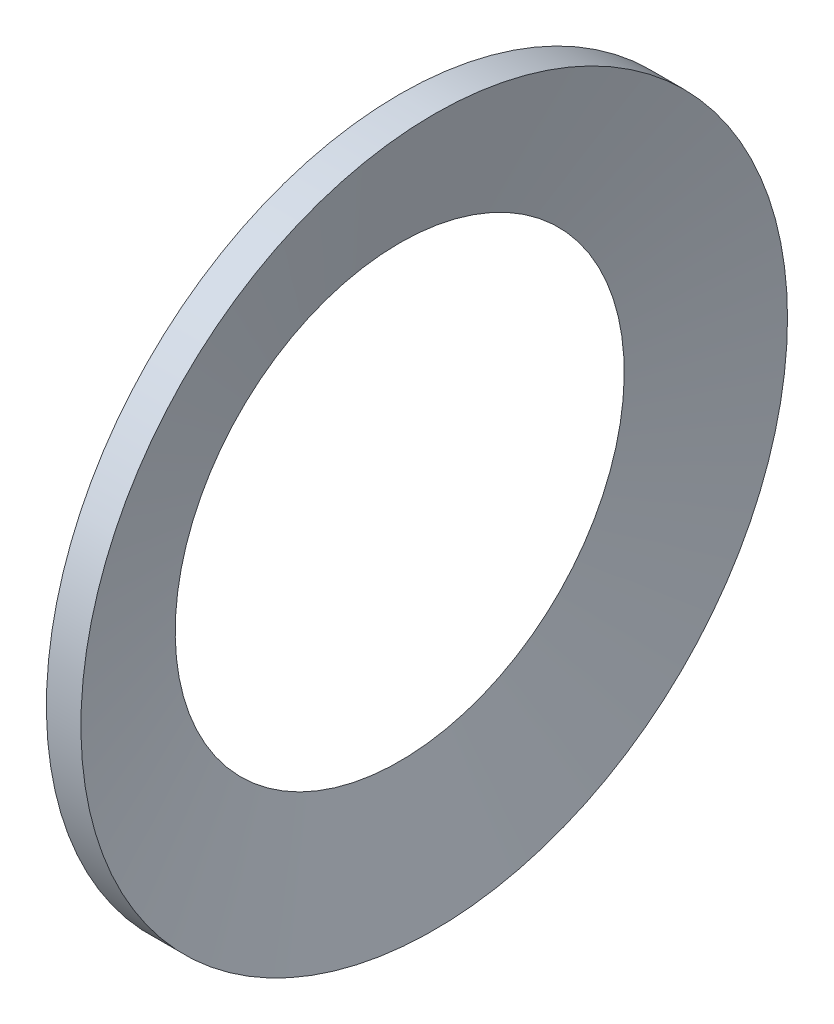
ISO-10303-21;
HEADER;
FILE_DESCRIPTION(('STEP AP214'),'2;1');
FILE_NAME('part.step','',(''),(''),'','','');
FILE_SCHEMA(('AUTOMOTIVE_DESIGN { 1 0 10303 214 1 1 1 1 }'));
ENDSEC;
DATA;
#1=APPLICATION_CONTEXT('core data for automotive mechanical design processes');
#2=APPLICATION_PROTOCOL_DEFINITION('international standard','automotive_design',2000,#1);
#3=PRODUCT_CONTEXT('',#1,'mechanical');
#4=PRODUCT('Part','Part','',(#3));
#5=PRODUCT_RELATED_PRODUCT_CATEGORY('part','',(#4));
#6=PRODUCT_DEFINITION_FORMATION('','',#4);
#7=PRODUCT_DEFINITION_CONTEXT('part definition',#1,'design');
#8=PRODUCT_DEFINITION('design','',#6,#7);
#9=PRODUCT_DEFINITION_SHAPE('','',#8);
#10=(LENGTH_UNIT() NAMED_UNIT(*) SI_UNIT(.MILLI.,.METRE.));
#11=(NAMED_UNIT(*) PLANE_ANGLE_UNIT() SI_UNIT($,.RADIAN.));
#12=(NAMED_UNIT(*) SI_UNIT($,.STERADIAN.) SOLID_ANGLE_UNIT());
#13=UNCERTAINTY_MEASURE_WITH_UNIT(LENGTH_MEASURE(1.E-05),#10,'distance_accuracy_value','');
#14=(GEOMETRIC_REPRESENTATION_CONTEXT(3) GLOBAL_UNCERTAINTY_ASSIGNED_CONTEXT((#13)) GLOBAL_UNIT_ASSIGNED_CONTEXT((#10,
#11,#12)) REPRESENTATION_CONTEXT('',''));
#15=CARTESIAN_POINT('',(0.,0.,0.));
#16=DIRECTION('',(0.,0.,1.));
#17=DIRECTION('',(1.,0.,0.));
#18=AXIS2_PLACEMENT_3D('',#15,#16,#17);
#19=CARTESIAN_POINT('',(-13.7701675001608,-45.6048472350062,-2.0607016462834));
#20=DIRECTION('',(1.,0.,0.));
#21=DIRECTION('',(0.,1.,0.));
#22=AXIS2_PLACEMENT_3D('',#19,#20,#21);
#23=PLANE('',#22);
#24=CARTESIAN_POINT('',(-13.7701675001608,-45.6048473189957,-2.0607016462799));
#25=DIRECTION('',(1.,0.,0.));
#26=DIRECTION('',(0.,1.,0.));
#27=AXIS2_PLACEMENT_3D('',#24,#25,#26);
#28=CIRCLE('',#27,19.1927324349238);
#29=CARTESIAN_POINT('',(-13.7701675001608,-26.4121148840719,-2.0607016462799));
#30=VERTEX_POINT('',#29);
#31=EDGE_CURVE('E35',#30,#30,#28,.T.);
#32=ORIENTED_EDGE('',*,*,#31,.T.);
#33=EDGE_LOOP('',(#32));
#34=FACE_BOUND('',#33,.T.);
#35=CARTESIAN_POINT('',(-13.7701675001608,-45.6048472350062,-2.0607016462834));
#36=DIRECTION('',(1.,0.,0.));
#37=DIRECTION('',(0.,1.,0.));
#38=AXIS2_PLACEMENT_3D('',#35,#36,#37);
#39=CIRCLE('',#38,30.2016052722506);
#40=CARTESIAN_POINT('',(-13.7701675001608,-15.4032419627556,-2.0607016462834));
#41=VERTEX_POINT('',#40);
#42=EDGE_CURVE('E43',#41,#41,#39,.T.);
#43=ORIENTED_EDGE('',*,*,#42,.F.);
#44=EDGE_LOOP('',(#43));
#45=FACE_BOUND('',#44,.T.);
#46=ADVANCED_FACE('F31',(#34,#45),#23,.F.);
#47=CARTESIAN_POINT('',(-7.46832740778566,-45.6048472350062,-2.0607016462834));
#48=DIRECTION('',(-1.,0.,0.));
#49=DIRECTION('',(0.,-1.,0.));
#50=AXIS2_PLACEMENT_3D('',#47,#48,#49);
#51=CYLINDRICAL_SURFACE('',#50,30.2016052722506);
#52=CARTESIAN_POINT('',(-10.8203489138222,-45.6048473189957,-2.0607016462799));
#53=DIRECTION('',(1.,0.,0.));
#54=DIRECTION('',(0.,0.,-1.));
#55=AXIS2_PLACEMENT_3D('',#52,#53,#54);
#56=CIRCLE('',#55,30.2016052722506);
#57=CARTESIAN_POINT('',(-10.8203489138222,-45.6048473189957,-32.2623069185305));
#58=VERTEX_POINT('',#57);
#59=EDGE_CURVE('E10',#58,#58,#56,.F.);
#60=ORIENTED_EDGE('',*,*,#59,.T.);
#61=EDGE_LOOP('',(#60));
#62=FACE_BOUND('',#61,.T.);
#63=ORIENTED_EDGE('',*,*,#42,.T.);
#64=EDGE_LOOP('',(#63));
#65=FACE_BOUND('',#64,.T.);
#66=ADVANCED_FACE('F33',(#62,#65),#51,.T.);
#67=CARTESIAN_POINT('',(-9.39679038636605,-45.6048473189957,-2.0607016462799));
#68=DIRECTION('',(1.,0.,0.));
#69=DIRECTION('',(0.,8.3989501185433E-05,0.999999996472882));
#70=AXIS2_PLACEMENT_3D('',#67,#68,#69);
#71=CONICAL_SURFACE('',#70,35.514398024265,1.30899693899575);
#72=ORIENTED_EDGE('',*,*,#31,.F.);
#73=EDGE_LOOP('',(#72));
#74=FACE_BOUND('',#73,.T.);
#75=ORIENTED_EDGE('',*,*,#59,.F.);
#76=EDGE_LOOP('',(#75));
#77=FACE_BOUND('',#76,.T.);
#78=ADVANCED_FACE('F53',(#74,#77),#71,.F.);
#79=CLOSED_SHELL('',(#46,#66,#78));
#80=MANIFOLD_SOLID_BREP('B2',#79);
#81=ADVANCED_BREP_SHAPE_REPRESENTATION('',(#18,#80),#14);
#82=SHAPE_DEFINITION_REPRESENTATION(#9,#81);
ENDSEC;
END-ISO-10303-21;
